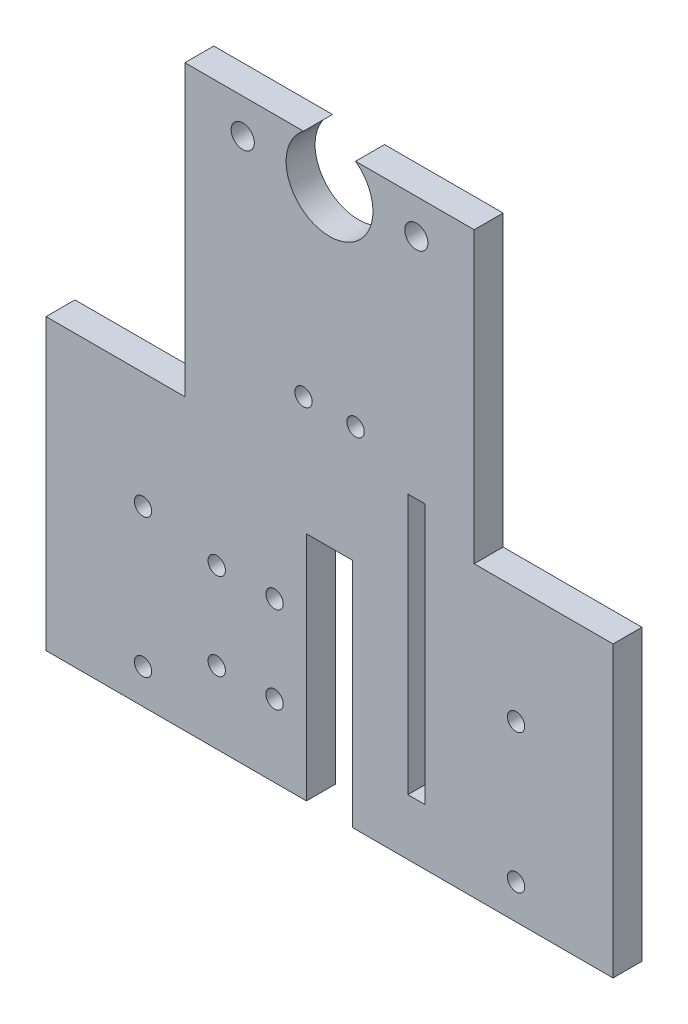
ISO-10303-21;
HEADER;
FILE_DESCRIPTION(('STEP AP214'),'2;1');
FILE_NAME('part.step','',(''),(''),'','','');
FILE_SCHEMA(('AUTOMOTIVE_DESIGN { 1 0 10303 214 1 1 1 1 }'));
ENDSEC;
DATA;
#1=APPLICATION_CONTEXT('core data for automotive mechanical design processes');
#2=APPLICATION_PROTOCOL_DEFINITION('international standard','automotive_design',2000,#1);
#3=PRODUCT_CONTEXT('',#1,'mechanical');
#4=PRODUCT('Part','Part','',(#3));
#5=PRODUCT_RELATED_PRODUCT_CATEGORY('part','',(#4));
#6=PRODUCT_DEFINITION_FORMATION('','',#4);
#7=PRODUCT_DEFINITION_CONTEXT('part definition',#1,'design');
#8=PRODUCT_DEFINITION('design','',#6,#7);
#9=PRODUCT_DEFINITION_SHAPE('','',#8);
#10=(LENGTH_UNIT() NAMED_UNIT(*) SI_UNIT(.MILLI.,.METRE.));
#11=(NAMED_UNIT(*) PLANE_ANGLE_UNIT() SI_UNIT($,.RADIAN.));
#12=(NAMED_UNIT(*) SI_UNIT($,.STERADIAN.) SOLID_ANGLE_UNIT());
#13=UNCERTAINTY_MEASURE_WITH_UNIT(LENGTH_MEASURE(1.E-05),#10,'distance_accuracy_value','');
#14=(GEOMETRIC_REPRESENTATION_CONTEXT(3) GLOBAL_UNCERTAINTY_ASSIGNED_CONTEXT((#13)) GLOBAL_UNIT_ASSIGNED_CONTEXT((#10,
#11,#12)) REPRESENTATION_CONTEXT('',''));
#15=CARTESIAN_POINT('',(0.,0.,0.));
#16=DIRECTION('',(0.,0.,1.));
#17=DIRECTION('',(1.,0.,0.));
#18=AXIS2_PLACEMENT_3D('',#15,#16,#17);
#19=CARTESIAN_POINT('',(32.235018022544,-44.,5.));
#20=DIRECTION('',(0.,0.,-1.));
#21=DIRECTION('',(-1.,0.,0.));
#22=AXIS2_PLACEMENT_3D('',#19,#20,#21);
#23=CYLINDRICAL_SURFACE('',#22,1.5);
#24=CARTESIAN_POINT('',(32.235018022544,-44.,5.));
#25=DIRECTION('',(0.,0.,-1.));
#26=DIRECTION('',(1.,0.,0.));
#27=AXIS2_PLACEMENT_3D('',#24,#25,#26);
#28=CIRCLE('',#27,1.5);
#29=CARTESIAN_POINT('',(33.735018022544,-44.,5.));
#30=VERTEX_POINT('',#29);
#31=EDGE_CURVE('E273',#30,#30,#28,.T.);
#32=ORIENTED_EDGE('',*,*,#31,.F.);
#33=EDGE_LOOP('',(#32));
#34=FACE_BOUND('',#33,.T.);
#35=CARTESIAN_POINT('',(32.235018022544,-44.,2.));
#36=DIRECTION('',(0.,0.,-1.));
#37=DIRECTION('',(-1.,0.,0.));
#38=AXIS2_PLACEMENT_3D('',#35,#36,#37);
#39=CIRCLE('',#38,1.5);
#40=CARTESIAN_POINT('',(30.735018022544,-44.,2.));
#41=VERTEX_POINT('',#40);
#42=EDGE_CURVE('E227',#41,#41,#39,.T.);
#43=ORIENTED_EDGE('',*,*,#42,.T.);
#44=EDGE_LOOP('',(#43));
#45=FACE_BOUND('',#44,.T.);
#46=ADVANCED_FACE('F39',(#34,#45),#23,.F.);
#47=CARTESIAN_POINT('',(-32.235018022544,-20.,5.));
#48=DIRECTION('',(0.,0.,-1.));
#49=DIRECTION('',(-1.,0.,0.));
#50=AXIS2_PLACEMENT_3D('',#47,#48,#49);
#51=CYLINDRICAL_SURFACE('',#50,1.5);
#52=CARTESIAN_POINT('',(-32.235018022544,-20.,5.));
#53=DIRECTION('',(0.,0.,-1.));
#54=DIRECTION('',(-1.,0.,0.));
#55=AXIS2_PLACEMENT_3D('',#52,#53,#54);
#56=CIRCLE('',#55,1.5);
#57=CARTESIAN_POINT('',(-33.735018022544,-20.,5.));
#58=VERTEX_POINT('',#57);
#59=EDGE_CURVE('E261',#58,#58,#56,.T.);
#60=ORIENTED_EDGE('',*,*,#59,.F.);
#61=EDGE_LOOP('',(#60));
#62=FACE_BOUND('',#61,.T.);
#63=CARTESIAN_POINT('',(-32.235018022544,-20.,2.));
#64=DIRECTION('',(0.,0.,-1.));
#65=DIRECTION('',(-1.,0.,0.));
#66=AXIS2_PLACEMENT_3D('',#63,#64,#65);
#67=CIRCLE('',#66,1.5);
#68=CARTESIAN_POINT('',(-33.735018022544,-20.,2.));
#69=VERTEX_POINT('',#68);
#70=EDGE_CURVE('E231',#69,#69,#67,.T.);
#71=ORIENTED_EDGE('',*,*,#70,.T.);
#72=EDGE_LOOP('',(#71));
#73=FACE_BOUND('',#72,.T.);
#74=ADVANCED_FACE('F510',(#62,#73),#51,.F.);
#75=CARTESIAN_POINT('',(-32.2350180225441,-44.,5.));
#76=DIRECTION('',(0.,0.,-1.));
#77=DIRECTION('',(-1.,0.,0.));
#78=AXIS2_PLACEMENT_3D('',#75,#76,#77);
#79=CYLINDRICAL_SURFACE('',#78,1.5);
#80=CARTESIAN_POINT('',(-32.2350180225441,-44.,5.));
#81=DIRECTION('',(0.,0.,-1.));
#82=DIRECTION('',(-1.,0.,0.));
#83=AXIS2_PLACEMENT_3D('',#80,#81,#82);
#84=CIRCLE('',#83,1.5);
#85=CARTESIAN_POINT('',(-33.7350180225441,-44.,5.));
#86=VERTEX_POINT('',#85);
#87=EDGE_CURVE('E268',#86,#86,#84,.T.);
#88=ORIENTED_EDGE('',*,*,#87,.F.);
#89=EDGE_LOOP('',(#88));
#90=FACE_BOUND('',#89,.T.);
#91=CARTESIAN_POINT('',(-32.2350180225441,-44.,2.));
#92=DIRECTION('',(0.,0.,-1.));
#93=DIRECTION('',(-1.,0.,0.));
#94=AXIS2_PLACEMENT_3D('',#91,#92,#93);
#95=CIRCLE('',#94,1.5);
#96=CARTESIAN_POINT('',(-33.7350180225441,-44.,2.));
#97=VERTEX_POINT('',#96);
#98=EDGE_CURVE('E211',#97,#97,#95,.T.);
#99=ORIENTED_EDGE('',*,*,#98,.T.);
#100=EDGE_LOOP('',(#99));
#101=FACE_BOUND('',#100,.T.);
#102=ADVANCED_FACE('F516',(#90,#101),#79,.F.);
#103=CARTESIAN_POINT('',(32.235018022544,-20.,5.));
#104=DIRECTION('',(0.,0.,-1.));
#105=DIRECTION('',(-1.,0.,0.));
#106=AXIS2_PLACEMENT_3D('',#103,#104,#105);
#107=CYLINDRICAL_SURFACE('',#106,1.5);
#108=CARTESIAN_POINT('',(32.235018022544,-20.,5.));
#109=DIRECTION('',(0.,0.,-1.));
#110=DIRECTION('',(1.,0.,0.));
#111=AXIS2_PLACEMENT_3D('',#108,#109,#110);
#112=CIRCLE('',#111,1.5);
#113=CARTESIAN_POINT('',(33.735018022544,-20.,5.));
#114=VERTEX_POINT('',#113);
#115=EDGE_CURVE('E269',#114,#114,#112,.T.);
#116=ORIENTED_EDGE('',*,*,#115,.F.);
#117=EDGE_LOOP('',(#116));
#118=FACE_BOUND('',#117,.T.);
#119=CARTESIAN_POINT('',(32.235018022544,-20.,2.));
#120=DIRECTION('',(0.,0.,-1.));
#121=DIRECTION('',(-1.,0.,0.));
#122=AXIS2_PLACEMENT_3D('',#119,#120,#121);
#123=CIRCLE('',#122,1.5);
#124=CARTESIAN_POINT('',(30.735018022544,-20.,2.));
#125=VERTEX_POINT('',#124);
#126=EDGE_CURVE('E217',#125,#125,#123,.T.);
#127=ORIENTED_EDGE('',*,*,#126,.T.);
#128=EDGE_LOOP('',(#127));
#129=FACE_BOUND('',#128,.T.);
#130=ADVANCED_FACE('F567',(#118,#129),#107,.F.);
#131=CARTESIAN_POINT('',(-25.,-50.,5.));
#132=DIRECTION('',(0.,1.,0.));
#133=DIRECTION('',(0.,0.,1.));
#134=AXIS2_PLACEMENT_3D('',#131,#132,#133);
#135=PLANE('',#134);
#136=DIRECTION('',(1.,0.,0.));
#137=VECTOR('',#136,1.);
#138=CARTESIAN_POINT('',(-25.,-50.,0.));
#139=LINE('',#138,#137);
#140=CARTESIAN_POINT('',(-49.,-50.,0.));
#141=VERTEX_POINT('',#140);
#142=CARTESIAN_POINT('',(-4.,-50.,0.));
#143=VERTEX_POINT('',#142);
#144=EDGE_CURVE('E395',#141,#143,#139,.T.);
#145=ORIENTED_EDGE('',*,*,#144,.T.);
#146=DIRECTION('',(0.,0.,-1.));
#147=VECTOR('',#146,1.);
#148=CARTESIAN_POINT('',(-4.,-50.,5.));
#149=LINE('',#148,#147);
#150=CARTESIAN_POINT('',(-4.,-50.,5.));
#151=VERTEX_POINT('',#150);
#152=EDGE_CURVE('E308',#151,#143,#149,.T.);
#153=ORIENTED_EDGE('',*,*,#152,.F.);
#154=DIRECTION('',(1.,0.,0.));
#155=VECTOR('',#154,1.);
#156=CARTESIAN_POINT('',(25.,-50.,5.));
#157=LINE('',#156,#155);
#158=CARTESIAN_POINT('',(-49.,-50.,5.));
#159=VERTEX_POINT('',#158);
#160=EDGE_CURVE('E340',#159,#151,#157,.T.);
#161=ORIENTED_EDGE('',*,*,#160,.F.);
#162=DIRECTION('',(0.,0.,-1.));
#163=VECTOR('',#162,1.);
#164=CARTESIAN_POINT('',(-49.,-50.,5.));
#165=LINE('',#164,#163);
#166=EDGE_CURVE('E369',#159,#141,#165,.T.);
#167=ORIENTED_EDGE('',*,*,#166,.T.);
#168=EDGE_LOOP('',(#145,#153,#161,#167));
#169=FACE_BOUND('',#168,.T.);
#170=ADVANCED_FACE('F465',(#169),#135,.F.);
#171=CARTESIAN_POINT('',(-25.,50.,5.));
#172=DIRECTION('',(0.,-1.,0.));
#173=DIRECTION('',(0.,0.,-1.));
#174=AXIS2_PLACEMENT_3D('',#171,#172,#173);
#175=PLANE('',#174);
#176=DIRECTION('',(-1.,0.,0.));
#177=VECTOR('',#176,1.);
#178=CARTESIAN_POINT('',(-25.,50.,0.));
#179=LINE('',#178,#177);
#180=CARTESIAN_POINT('',(25.,50.,0.));
#181=VERTEX_POINT('',#180);
#182=CARTESIAN_POINT('',(4.50000000000001,50.,0.));
#183=VERTEX_POINT('',#182);
#184=EDGE_CURVE('E380',#181,#183,#179,.T.);
#185=ORIENTED_EDGE('',*,*,#184,.T.);
#186=DIRECTION('',(0.,0.,1.));
#187=VECTOR('',#186,1.);
#188=CARTESIAN_POINT('',(4.50000000000001,50.,-5.));
#189=LINE('',#188,#187);
#190=CARTESIAN_POINT('',(4.50000000000001,50.,5.));
#191=VERTEX_POINT('',#190);
#192=EDGE_CURVE('E11',#183,#191,#189,.T.);
#193=ORIENTED_EDGE('',*,*,#192,.T.);
#194=DIRECTION('',(-1.,0.,0.));
#195=VECTOR('',#194,1.);
#196=CARTESIAN_POINT('',(-25.,50.,5.));
#197=LINE('',#196,#195);
#198=CARTESIAN_POINT('',(25.,50.,5.));
#199=VERTEX_POINT('',#198);
#200=EDGE_CURVE('E355',#199,#191,#197,.T.);
#201=ORIENTED_EDGE('',*,*,#200,.F.);
#202=DIRECTION('',(0.,0.,-1.));
#203=VECTOR('',#202,1.);
#204=CARTESIAN_POINT('',(25.,50.,5.));
#205=LINE('',#204,#203);
#206=EDGE_CURVE('E414',#199,#181,#205,.T.);
#207=ORIENTED_EDGE('',*,*,#206,.T.);
#208=EDGE_LOOP('',(#185,#193,#201,#207));
#209=FACE_BOUND('',#208,.T.);
#210=ADVANCED_FACE('F496',(#209),#175,.F.);
#211=CARTESIAN_POINT('',(0.,0.,5.));
#212=DIRECTION('',(0.,0.,1.));
#213=DIRECTION('',(1.,0.,0.));
#214=AXIS2_PLACEMENT_3D('',#211,#212,#213);
#215=PLANE('',#214);
#216=CARTESIAN_POINT('',(-9.5,-37.5,5.));
#217=DIRECTION('',(0.,0.,1.));
#218=DIRECTION('',(1.,0.,0.));
#219=AXIS2_PLACEMENT_3D('',#216,#217,#218);
#220=CIRCLE('',#219,1.5);
#221=CARTESIAN_POINT('',(-8.,-37.5,5.));
#222=VERTEX_POINT('',#221);
#223=EDGE_CURVE('E891',#222,#222,#220,.T.);
#224=ORIENTED_EDGE('',*,*,#223,.F.);
#225=EDGE_LOOP('',(#224));
#226=FACE_BOUND('',#225,.T.);
#227=CARTESIAN_POINT('',(-19.5,-37.5,5.));
#228=DIRECTION('',(0.,0.,1.));
#229=DIRECTION('',(1.,0.,0.));
#230=AXIS2_PLACEMENT_3D('',#227,#228,#229);
#231=CIRCLE('',#230,1.5);
#232=CARTESIAN_POINT('',(-18.,-37.5,5.));
#233=VERTEX_POINT('',#232);
#234=EDGE_CURVE('E897',#233,#233,#231,.T.);
#235=ORIENTED_EDGE('',*,*,#234,.F.);
#236=EDGE_LOOP('',(#235));
#237=FACE_BOUND('',#236,.T.);
#238=CARTESIAN_POINT('',(-19.5,-22.5,5.));
#239=DIRECTION('',(0.,0.,1.));
#240=DIRECTION('',(1.,0.,0.));
#241=AXIS2_PLACEMENT_3D('',#238,#239,#240);
#242=CIRCLE('',#241,1.5);
#243=CARTESIAN_POINT('',(-18.,-22.5,5.));
#244=VERTEX_POINT('',#243);
#245=EDGE_CURVE('E912',#244,#244,#242,.T.);
#246=ORIENTED_EDGE('',*,*,#245,.F.);
#247=EDGE_LOOP('',(#246));
#248=FACE_BOUND('',#247,.T.);
#249=CARTESIAN_POINT('',(-9.5,-22.5,5.));
#250=DIRECTION('',(0.,0.,1.));
#251=DIRECTION('',(1.,0.,0.));
#252=AXIS2_PLACEMENT_3D('',#249,#250,#251);
#253=CIRCLE('',#252,1.5);
#254=CARTESIAN_POINT('',(-8.,-22.5,5.));
#255=VERTEX_POINT('',#254);
#256=EDGE_CURVE('E916',#255,#255,#253,.T.);
#257=ORIENTED_EDGE('',*,*,#256,.F.);
#258=EDGE_LOOP('',(#257));
#259=FACE_BOUND('',#258,.T.);
#260=CARTESIAN_POINT('',(4.5,10.25,5.));
#261=DIRECTION('',(0.,0.,1.));
#262=DIRECTION('',(1.,0.,0.));
#263=AXIS2_PLACEMENT_3D('',#260,#261,#262);
#264=CIRCLE('',#263,1.5);
#265=CARTESIAN_POINT('',(5.99999999999999,10.25,5.));
#266=VERTEX_POINT('',#265);
#267=EDGE_CURVE('E193',#266,#266,#264,.T.);
#268=ORIENTED_EDGE('',*,*,#267,.F.);
#269=EDGE_LOOP('',(#268));
#270=FACE_BOUND('',#269,.T.);
#271=CARTESIAN_POINT('',(-4.49999999999998,10.25,5.));
#272=DIRECTION('',(0.,0.,1.));
#273=DIRECTION('',(1.,0.,0.));
#274=AXIS2_PLACEMENT_3D('',#271,#272,#273);
#275=CIRCLE('',#274,1.5);
#276=CARTESIAN_POINT('',(-2.99999999999999,10.25,5.));
#277=VERTEX_POINT('',#276);
#278=EDGE_CURVE('E884',#277,#277,#275,.T.);
#279=ORIENTED_EDGE('',*,*,#278,.F.);
#280=EDGE_LOOP('',(#279));
#281=FACE_BOUND('',#280,.T.);
#282=DIRECTION('',(0.,1.,0.));
#283=VECTOR('',#282,1.);
#284=CARTESIAN_POINT('',(13.5359264064246,4.71025987059766,5.));
#285=LINE('',#284,#283);
#286=CARTESIAN_POINT('',(13.5359264064246,-40.2897401294023,5.));
#287=VERTEX_POINT('',#286);
#288=CARTESIAN_POINT('',(13.5359264064246,4.71025987059766,5.));
#289=VERTEX_POINT('',#288);
#290=EDGE_CURVE('E167',#287,#289,#285,.T.);
#291=ORIENTED_EDGE('',*,*,#290,.T.);
#292=DIRECTION('',(1.,0.,0.));
#293=VECTOR('',#292,1.);
#294=CARTESIAN_POINT('',(13.5359264064246,4.71025987059766,5.));
#295=LINE('',#294,#293);
#296=CARTESIAN_POINT('',(16.5359264064246,4.71025987059766,5.));
#297=VERTEX_POINT('',#296);
#298=EDGE_CURVE('E177',#289,#297,#295,.T.);
#299=ORIENTED_EDGE('',*,*,#298,.T.);
#300=DIRECTION('',(0.,-1.,0.));
#301=VECTOR('',#300,1.);
#302=CARTESIAN_POINT('',(16.5359264064246,4.71025987059766,5.));
#303=LINE('',#302,#301);
#304=CARTESIAN_POINT('',(16.5359264064246,-40.2897401294023,5.));
#305=VERTEX_POINT('',#304);
#306=EDGE_CURVE('E55',#297,#305,#303,.T.);
#307=ORIENTED_EDGE('',*,*,#306,.T.);
#308=DIRECTION('',(-1.,0.,0.));
#309=VECTOR('',#308,1.);
#310=CARTESIAN_POINT('',(13.5359264064246,-40.2897401294023,5.));
#311=LINE('',#310,#309);
#312=EDGE_CURVE('E174',#305,#287,#311,.T.);
#313=ORIENTED_EDGE('',*,*,#312,.T.);
#314=EDGE_LOOP('',(#291,#299,#307,#313));
#315=FACE_BOUND('',#314,.T.);
#316=ORIENTED_EDGE('',*,*,#115,.T.);
#317=EDGE_LOOP('',(#316));
#318=FACE_BOUND('',#317,.T.);
#319=ORIENTED_EDGE('',*,*,#87,.T.);
#320=EDGE_LOOP('',(#319));
#321=FACE_BOUND('',#320,.T.);
#322=ORIENTED_EDGE('',*,*,#59,.T.);
#323=EDGE_LOOP('',(#322));
#324=FACE_BOUND('',#323,.T.);
#325=ORIENTED_EDGE('',*,*,#31,.T.);
#326=EDGE_LOOP('',(#325));
#327=FACE_BOUND('',#326,.T.);
#328=DIRECTION('',(0.,1.,0.));
#329=VECTOR('',#328,1.);
#330=CARTESIAN_POINT('',(-4.,-50.,5.));
#331=LINE('',#330,#329);
#332=CARTESIAN_POINT('',(-4.,-9.99999999999999,5.));
#333=VERTEX_POINT('',#332);
#334=EDGE_CURVE('E290',#151,#333,#331,.T.);
#335=ORIENTED_EDGE('',*,*,#334,.T.);
#336=DIRECTION('',(1.,0.,0.));
#337=VECTOR('',#336,1.);
#338=CARTESIAN_POINT('',(-4.,-9.99999999999999,5.));
#339=LINE('',#338,#337);
#340=CARTESIAN_POINT('',(4.,-10.,5.));
#341=VERTEX_POINT('',#340);
#342=EDGE_CURVE('E281',#333,#341,#339,.T.);
#343=ORIENTED_EDGE('',*,*,#342,.T.);
#344=DIRECTION('',(0.,-1.,0.));
#345=VECTOR('',#344,1.);
#346=CARTESIAN_POINT('',(4.,-10.,5.));
#347=LINE('',#346,#345);
#348=CARTESIAN_POINT('',(4.,-50.0000000000002,5.));
#349=VERTEX_POINT('',#348);
#350=EDGE_CURVE('E285',#341,#349,#347,.T.);
#351=ORIENTED_EDGE('',*,*,#350,.T.);
#352=CARTESIAN_POINT('',(49.,-50.,5.));
#353=VERTEX_POINT('',#352);
#354=EDGE_CURVE('E345',#349,#353,#157,.T.);
#355=ORIENTED_EDGE('',*,*,#354,.T.);
#356=DIRECTION('',(0.,1.,0.));
#357=VECTOR('',#356,1.);
#358=CARTESIAN_POINT('',(49.,-50.,5.));
#359=LINE('',#358,#357);
#360=CARTESIAN_POINT('',(49.,0.,5.));
#361=VERTEX_POINT('',#360);
#362=EDGE_CURVE('E344',#353,#361,#359,.T.);
#363=ORIENTED_EDGE('',*,*,#362,.T.);
#364=DIRECTION('',(-1.,0.,0.));
#365=VECTOR('',#364,1.);
#366=CARTESIAN_POINT('',(49.,0.,5.));
#367=LINE('',#366,#365);
#368=CARTESIAN_POINT('',(25.,0.,5.));
#369=VERTEX_POINT('',#368);
#370=EDGE_CURVE('E348',#361,#369,#367,.T.);
#371=ORIENTED_EDGE('',*,*,#370,.T.);
#372=DIRECTION('',(0.,1.,0.));
#373=VECTOR('',#372,1.);
#374=CARTESIAN_POINT('',(25.,32.4243225836377,5.));
#375=LINE('',#374,#373);
#376=EDGE_CURVE('E351',#369,#199,#375,.T.);
#377=ORIENTED_EDGE('',*,*,#376,.T.);
#378=ORIENTED_EDGE('',*,*,#200,.T.);
#379=CARTESIAN_POINT('',(0.,44.,5.));
#380=DIRECTION('',(0.,0.,1.));
#381=DIRECTION('',(1.,0.,0.));
#382=AXIS2_PLACEMENT_3D('',#379,#380,#381);
#383=CIRCLE('',#382,7.5);
#384=CARTESIAN_POINT('',(-4.5,50.,5.));
#385=VERTEX_POINT('',#384);
#386=EDGE_CURVE('E307',#385,#191,#383,.T.);
#387=ORIENTED_EDGE('',*,*,#386,.F.);
#388=CARTESIAN_POINT('',(-25.,50.,5.));
#389=VERTEX_POINT('',#388);
#390=EDGE_CURVE('E354',#385,#389,#197,.T.);
#391=ORIENTED_EDGE('',*,*,#390,.T.);
#392=DIRECTION('',(0.,-1.,0.));
#393=VECTOR('',#392,1.);
#394=CARTESIAN_POINT('',(-25.,50.,5.));
#395=LINE('',#394,#393);
#396=CARTESIAN_POINT('',(-25.,0.,5.));
#397=VERTEX_POINT('',#396);
#398=EDGE_CURVE('E359',#389,#397,#395,.T.);
#399=ORIENTED_EDGE('',*,*,#398,.T.);
#400=DIRECTION('',(-1.,0.,0.));
#401=VECTOR('',#400,1.);
#402=CARTESIAN_POINT('',(-49.,0.,5.));
#403=LINE('',#402,#401);
#404=CARTESIAN_POINT('',(-49.,0.,5.));
#405=VERTEX_POINT('',#404);
#406=EDGE_CURVE('E362',#397,#405,#403,.T.);
#407=ORIENTED_EDGE('',*,*,#406,.T.);
#408=DIRECTION('',(0.,-1.,0.));
#409=VECTOR('',#408,1.);
#410=CARTESIAN_POINT('',(-49.,-50.,5.));
#411=LINE('',#410,#409);
#412=EDGE_CURVE('E365',#405,#159,#411,.T.);
#413=ORIENTED_EDGE('',*,*,#412,.T.);
#414=ORIENTED_EDGE('',*,*,#160,.T.);
#415=EDGE_LOOP('',(#335,#343,#351,#355,#363,#371,#377,#378,#387,#391,#399,#407,#413,#414));
#416=FACE_BOUND('',#415,.T.);
#417=CARTESIAN_POINT('',(-15.,44.,5.));
#418=DIRECTION('',(0.,0.,1.));
#419=DIRECTION('',(1.,0.,0.));
#420=AXIS2_PLACEMENT_3D('',#417,#418,#419);
#421=CIRCLE('',#420,2.);
#422=CARTESIAN_POINT('',(-13.,44.,5.));
#423=VERTEX_POINT('',#422);
#424=EDGE_CURVE('E332',#423,#423,#421,.T.);
#425=ORIENTED_EDGE('',*,*,#424,.F.);
#426=EDGE_LOOP('',(#425));
#427=FACE_BOUND('',#426,.T.);
#428=CARTESIAN_POINT('',(15.,44.,5.));
#429=DIRECTION('',(0.,0.,1.));
#430=DIRECTION('',(-1.,0.,0.));
#431=AXIS2_PLACEMENT_3D('',#428,#429,#430);
#432=CIRCLE('',#431,2.);
#433=CARTESIAN_POINT('',(13.,44.,5.));
#434=VERTEX_POINT('',#433);
#435=EDGE_CURVE('E324',#434,#434,#432,.T.);
#436=ORIENTED_EDGE('',*,*,#435,.F.);
#437=EDGE_LOOP('',(#436));
#438=FACE_BOUND('',#437,.T.);
#439=ADVANCED_FACE('F182',(#226,#237,#248,#259,#270,#281,#315,#318,#321,#324,#327,#416,#427,
#438),#215,.T.);
#440=CARTESIAN_POINT('',(0.,0.,0.));
#441=DIRECTION('',(0.,0.,1.));
#442=DIRECTION('',(1.,0.,0.));
#443=AXIS2_PLACEMENT_3D('',#440,#441,#442);
#444=PLANE('',#443);
#445=CARTESIAN_POINT('',(-9.5,-37.5,0.));
#446=DIRECTION('',(0.,0.,-1.));
#447=DIRECTION('',(-1.,0.,0.));
#448=AXIS2_PLACEMENT_3D('',#445,#446,#447);
#449=CIRCLE('',#448,1.5);
#450=CARTESIAN_POINT('',(-11.,-37.5,0.));
#451=VERTEX_POINT('',#450);
#452=EDGE_CURVE('E925',#451,#451,#449,.T.);
#453=ORIENTED_EDGE('',*,*,#452,.F.);
#454=EDGE_LOOP('',(#453));
#455=FACE_BOUND('',#454,.T.);
#456=CARTESIAN_POINT('',(-19.5,-37.5,0.));
#457=DIRECTION('',(0.,0.,-1.));
#458=DIRECTION('',(-1.,0.,0.));
#459=AXIS2_PLACEMENT_3D('',#456,#457,#458);
#460=CIRCLE('',#459,1.5);
#461=CARTESIAN_POINT('',(-21.,-37.5,0.));
#462=VERTEX_POINT('',#461);
#463=EDGE_CURVE('E929',#462,#462,#460,.T.);
#464=ORIENTED_EDGE('',*,*,#463,.F.);
#465=EDGE_LOOP('',(#464));
#466=FACE_BOUND('',#465,.T.);
#467=CARTESIAN_POINT('',(-19.5,-22.5,0.));
#468=DIRECTION('',(0.,0.,-1.));
#469=DIRECTION('',(-1.,0.,0.));
#470=AXIS2_PLACEMENT_3D('',#467,#468,#469);
#471=CIRCLE('',#470,1.5);
#472=CARTESIAN_POINT('',(-21.,-22.5,0.));
#473=VERTEX_POINT('',#472);
#474=EDGE_CURVE('E924',#473,#473,#471,.T.);
#475=ORIENTED_EDGE('',*,*,#474,.F.);
#476=EDGE_LOOP('',(#475));
#477=FACE_BOUND('',#476,.T.);
#478=CARTESIAN_POINT('',(-9.5,-22.5,0.));
#479=DIRECTION('',(0.,0.,-1.));
#480=DIRECTION('',(-1.,0.,0.));
#481=AXIS2_PLACEMENT_3D('',#478,#479,#480);
#482=CIRCLE('',#481,1.5);
#483=CARTESIAN_POINT('',(-11.,-22.5,0.));
#484=VERTEX_POINT('',#483);
#485=EDGE_CURVE('E920',#484,#484,#482,.T.);
#486=ORIENTED_EDGE('',*,*,#485,.F.);
#487=EDGE_LOOP('',(#486));
#488=FACE_BOUND('',#487,.T.);
#489=CARTESIAN_POINT('',(4.5,10.25,0.));
#490=DIRECTION('',(0.,0.,-1.));
#491=DIRECTION('',(-1.,0.,0.));
#492=AXIS2_PLACEMENT_3D('',#489,#490,#491);
#493=CIRCLE('',#492,1.5);
#494=CARTESIAN_POINT('',(3.,10.25,0.));
#495=VERTEX_POINT('',#494);
#496=EDGE_CURVE('E890',#495,#495,#493,.T.);
#497=ORIENTED_EDGE('',*,*,#496,.F.);
#498=EDGE_LOOP('',(#497));
#499=FACE_BOUND('',#498,.T.);
#500=CARTESIAN_POINT('',(-4.49999999999998,10.25,0.));
#501=DIRECTION('',(0.,0.,-1.));
#502=DIRECTION('',(1.,0.,0.));
#503=AXIS2_PLACEMENT_3D('',#500,#501,#502);
#504=CIRCLE('',#503,1.5);
#505=CARTESIAN_POINT('',(-2.99999999999999,10.25,0.));
#506=VERTEX_POINT('',#505);
#507=EDGE_CURVE('E887',#506,#506,#504,.T.);
#508=ORIENTED_EDGE('',*,*,#507,.F.);
#509=EDGE_LOOP('',(#508));
#510=FACE_BOUND('',#509,.T.);
#511=DIRECTION('',(1.,0.,0.));
#512=VECTOR('',#511,1.);
#513=CARTESIAN_POINT('',(13.5359264064246,4.71025987059766,0.));
#514=LINE('',#513,#512);
#515=CARTESIAN_POINT('',(13.5359264064246,4.71025987059766,0.));
#516=VERTEX_POINT('',#515);
#517=CARTESIAN_POINT('',(16.5359264064246,4.71025987059766,0.));
#518=VERTEX_POINT('',#517);
#519=EDGE_CURVE('E202',#516,#518,#514,.T.);
#520=ORIENTED_EDGE('',*,*,#519,.F.);
#521=DIRECTION('',(0.,1.,0.));
#522=VECTOR('',#521,1.);
#523=CARTESIAN_POINT('',(13.5359264064246,4.71025987059766,0.));
#524=LINE('',#523,#522);
#525=CARTESIAN_POINT('',(13.5359264064246,-40.2897401294023,0.));
#526=VERTEX_POINT('',#525);
#527=EDGE_CURVE('E63',#526,#516,#524,.T.);
#528=ORIENTED_EDGE('',*,*,#527,.F.);
#529=DIRECTION('',(-1.,0.,0.));
#530=VECTOR('',#529,1.);
#531=CARTESIAN_POINT('',(13.5359264064246,-40.2897401294023,0.));
#532=LINE('',#531,#530);
#533=CARTESIAN_POINT('',(16.5359264064246,-40.2897401294023,0.));
#534=VERTEX_POINT('',#533);
#535=EDGE_CURVE('E186',#534,#526,#532,.T.);
#536=ORIENTED_EDGE('',*,*,#535,.F.);
#537=DIRECTION('',(0.,-1.,0.));
#538=VECTOR('',#537,1.);
#539=CARTESIAN_POINT('',(16.5359264064246,4.71025987059766,0.));
#540=LINE('',#539,#538);
#541=EDGE_CURVE('E190',#518,#534,#540,.T.);
#542=ORIENTED_EDGE('',*,*,#541,.F.);
#543=EDGE_LOOP('',(#520,#528,#536,#542));
#544=FACE_BOUND('',#543,.T.);
#545=CARTESIAN_POINT('',(-32.2350180225441,-44.,0.));
#546=DIRECTION('',(0.,0.,-1.));
#547=DIRECTION('',(-1.,0.,0.));
#548=AXIS2_PLACEMENT_3D('',#545,#546,#547);
#549=CIRCLE('',#548,4.50000000000001);
#550=CARTESIAN_POINT('',(-36.7350180225441,-44.,0.));
#551=VERTEX_POINT('',#550);
#552=EDGE_CURVE('E246',#551,#551,#549,.T.);
#553=ORIENTED_EDGE('',*,*,#552,.F.);
#554=EDGE_LOOP('',(#553));
#555=FACE_BOUND('',#554,.T.);
#556=CARTESIAN_POINT('',(-32.235018022544,-20.,0.));
#557=DIRECTION('',(0.,0.,-1.));
#558=DIRECTION('',(-1.,0.,0.));
#559=AXIS2_PLACEMENT_3D('',#556,#557,#558);
#560=CIRCLE('',#559,4.5);
#561=CARTESIAN_POINT('',(-36.7350180225441,-20.,0.));
#562=VERTEX_POINT('',#561);
#563=EDGE_CURVE('E235',#562,#562,#560,.T.);
#564=ORIENTED_EDGE('',*,*,#563,.F.);
#565=EDGE_LOOP('',(#564));
#566=FACE_BOUND('',#565,.T.);
#567=CARTESIAN_POINT('',(32.235018022544,-20.,0.));
#568=DIRECTION('',(0.,0.,-1.));
#569=DIRECTION('',(-1.,0.,0.));
#570=AXIS2_PLACEMENT_3D('',#567,#568,#569);
#571=CIRCLE('',#570,4.5);
#572=CARTESIAN_POINT('',(27.735018022544,-20.,0.));
#573=VERTEX_POINT('',#572);
#574=EDGE_CURVE('E221',#573,#573,#571,.T.);
#575=ORIENTED_EDGE('',*,*,#574,.F.);
#576=EDGE_LOOP('',(#575));
#577=FACE_BOUND('',#576,.T.);
#578=CARTESIAN_POINT('',(32.235018022544,-44.,0.));
#579=DIRECTION('',(0.,0.,-1.));
#580=DIRECTION('',(-1.,0.,0.));
#581=AXIS2_PLACEMENT_3D('',#578,#579,#580);
#582=CIRCLE('',#581,4.5);
#583=CARTESIAN_POINT('',(27.735018022544,-44.,0.));
#584=VERTEX_POINT('',#583);
#585=EDGE_CURVE('E256',#584,#584,#582,.T.);
#586=ORIENTED_EDGE('',*,*,#585,.F.);
#587=EDGE_LOOP('',(#586));
#588=FACE_BOUND('',#587,.T.);
#589=DIRECTION('',(1.,0.,0.));
#590=VECTOR('',#589,1.);
#591=CARTESIAN_POINT('',(-4.,-9.99999999999999,0.));
#592=LINE('',#591,#590);
#593=CARTESIAN_POINT('',(-4.,-9.99999999999999,0.));
#594=VERTEX_POINT('',#593);
#595=CARTESIAN_POINT('',(4.,-10.,0.));
#596=VERTEX_POINT('',#595);
#597=EDGE_CURVE('E280',#594,#596,#592,.T.);
#598=ORIENTED_EDGE('',*,*,#597,.F.);
#599=DIRECTION('',(0.,1.,0.));
#600=VECTOR('',#599,1.);
#601=CARTESIAN_POINT('',(-4.,-50.,0.));
#602=LINE('',#601,#600);
#603=EDGE_CURVE('E286',#143,#594,#602,.T.);
#604=ORIENTED_EDGE('',*,*,#603,.F.);
#605=ORIENTED_EDGE('',*,*,#144,.F.);
#606=DIRECTION('',(0.,-1.,0.));
#607=VECTOR('',#606,1.);
#608=CARTESIAN_POINT('',(-49.,-50.,0.));
#609=LINE('',#608,#607);
#610=CARTESIAN_POINT('',(-49.,0.,0.));
#611=VERTEX_POINT('',#610);
#612=EDGE_CURVE('E390',#611,#141,#609,.T.);
#613=ORIENTED_EDGE('',*,*,#612,.F.);
#614=DIRECTION('',(-1.,0.,0.));
#615=VECTOR('',#614,1.);
#616=CARTESIAN_POINT('',(-49.,0.,0.));
#617=LINE('',#616,#615);
#618=CARTESIAN_POINT('',(-25.,0.,0.));
#619=VERTEX_POINT('',#618);
#620=EDGE_CURVE('E387',#619,#611,#617,.T.);
#621=ORIENTED_EDGE('',*,*,#620,.F.);
#622=DIRECTION('',(0.,-1.,0.));
#623=VECTOR('',#622,1.);
#624=CARTESIAN_POINT('',(-25.,32.4243225836377,0.));
#625=LINE('',#624,#623);
#626=CARTESIAN_POINT('',(-25.,50.,0.));
#627=VERTEX_POINT('',#626);
#628=EDGE_CURVE('E384',#627,#619,#625,.T.);
#629=ORIENTED_EDGE('',*,*,#628,.F.);
#630=CARTESIAN_POINT('',(-4.5,50.,0.));
#631=VERTEX_POINT('',#630);
#632=EDGE_CURVE('E379',#631,#627,#179,.T.);
#633=ORIENTED_EDGE('',*,*,#632,.F.);
#634=CARTESIAN_POINT('',(0.,44.,0.));
#635=DIRECTION('',(0.,0.,1.));
#636=DIRECTION('',(1.,0.,0.));
#637=AXIS2_PLACEMENT_3D('',#634,#635,#636);
#638=CIRCLE('',#637,7.5);
#639=EDGE_CURVE('E319',#631,#183,#638,.T.);
#640=ORIENTED_EDGE('',*,*,#639,.T.);
#641=ORIENTED_EDGE('',*,*,#184,.F.);
#642=DIRECTION('',(0.,1.,0.));
#643=VECTOR('',#642,1.);
#644=CARTESIAN_POINT('',(25.,50.,0.));
#645=LINE('',#644,#643);
#646=CARTESIAN_POINT('',(25.,0.,0.));
#647=VERTEX_POINT('',#646);
#648=EDGE_CURVE('E376',#647,#181,#645,.T.);
#649=ORIENTED_EDGE('',*,*,#648,.F.);
#650=DIRECTION('',(-1.,0.,0.));
#651=VECTOR('',#650,1.);
#652=CARTESIAN_POINT('',(49.,0.,0.));
#653=LINE('',#652,#651);
#654=CARTESIAN_POINT('',(49.,0.,0.));
#655=VERTEX_POINT('',#654);
#656=EDGE_CURVE('E372',#655,#647,#653,.T.);
#657=ORIENTED_EDGE('',*,*,#656,.F.);
#658=DIRECTION('',(0.,1.,0.));
#659=VECTOR('',#658,1.);
#660=CARTESIAN_POINT('',(49.,-50.,0.));
#661=LINE('',#660,#659);
#662=CARTESIAN_POINT('',(49.,-50.,0.));
#663=VERTEX_POINT('',#662);
#664=EDGE_CURVE('E336',#663,#655,#661,.T.);
#665=ORIENTED_EDGE('',*,*,#664,.F.);
#666=CARTESIAN_POINT('',(4.,-50.,0.));
#667=VERTEX_POINT('',#666);
#668=EDGE_CURVE('E394',#667,#663,#139,.T.);
#669=ORIENTED_EDGE('',*,*,#668,.F.);
#670=DIRECTION('',(0.,-1.,0.));
#671=VECTOR('',#670,1.);
#672=CARTESIAN_POINT('',(4.,-10.,0.));
#673=LINE('',#672,#671);
#674=EDGE_CURVE('E298',#596,#667,#673,.T.);
#675=ORIENTED_EDGE('',*,*,#674,.F.);
#676=EDGE_LOOP('',(#598,#604,#605,#613,#621,#629,#633,#640,#641,#649,#657,#665,#669,#675));
#677=FACE_BOUND('',#676,.T.);
#678=CARTESIAN_POINT('',(-15.,44.,0.));
#679=DIRECTION('',(0.,0.,1.));
#680=DIRECTION('',(1.,0.,0.));
#681=AXIS2_PLACEMENT_3D('',#678,#679,#680);
#682=CIRCLE('',#681,2.);
#683=CARTESIAN_POINT('',(-13.,44.,0.));
#684=VERTEX_POINT('',#683);
#685=EDGE_CURVE('E328',#684,#684,#682,.T.);
#686=ORIENTED_EDGE('',*,*,#685,.T.);
#687=EDGE_LOOP('',(#686));
#688=FACE_BOUND('',#687,.T.);
#689=CARTESIAN_POINT('',(15.,44.,0.));
#690=DIRECTION('',(0.,0.,1.));
#691=DIRECTION('',(-1.,0.,0.));
#692=AXIS2_PLACEMENT_3D('',#689,#690,#691);
#693=CIRCLE('',#692,2.);
#694=CARTESIAN_POINT('',(13.,44.,0.));
#695=VERTEX_POINT('',#694);
#696=EDGE_CURVE('E323',#695,#695,#693,.T.);
#697=ORIENTED_EDGE('',*,*,#696,.T.);
#698=EDGE_LOOP('',(#697));
#699=FACE_BOUND('',#698,.T.);
#700=ADVANCED_FACE('F441',(#455,#466,#477,#488,#499,#510,#544,#555,#566,#577,#588,#677,#688,
#699),#444,.F.);
#701=CARTESIAN_POINT('',(49.,-50.,5.));
#702=DIRECTION('',(-1.,0.,0.));
#703=DIRECTION('',(0.,-1.,0.));
#704=AXIS2_PLACEMENT_3D('',#701,#702,#703);
#705=PLANE('',#704);
#706=ORIENTED_EDGE('',*,*,#664,.T.);
#707=DIRECTION('',(0.,0.,-1.));
#708=VECTOR('',#707,1.);
#709=CARTESIAN_POINT('',(49.,0.,5.));
#710=LINE('',#709,#708);
#711=EDGE_CURVE('E422',#361,#655,#710,.T.);
#712=ORIENTED_EDGE('',*,*,#711,.F.);
#713=ORIENTED_EDGE('',*,*,#362,.F.);
#714=DIRECTION('',(0.,0.,-1.));
#715=VECTOR('',#714,1.);
#716=CARTESIAN_POINT('',(49.,-50.,5.));
#717=LINE('',#716,#715);
#718=EDGE_CURVE('E426',#353,#663,#717,.T.);
#719=ORIENTED_EDGE('',*,*,#718,.T.);
#720=EDGE_LOOP('',(#706,#712,#713,#719));
#721=FACE_BOUND('',#720,.T.);
#722=ADVANCED_FACE('F41',(#721),#705,.F.);
#723=CARTESIAN_POINT('',(49.,0.,5.));
#724=DIRECTION('',(0.,-1.,0.));
#725=DIRECTION('',(1.,0.,0.));
#726=AXIS2_PLACEMENT_3D('',#723,#724,#725);
#727=PLANE('',#726);
#728=ORIENTED_EDGE('',*,*,#656,.T.);
#729=DIRECTION('',(0.,0.,-1.));
#730=VECTOR('',#729,1.);
#731=CARTESIAN_POINT('',(25.,0.,5.));
#732=LINE('',#731,#730);
#733=EDGE_CURVE('E418',#369,#647,#732,.T.);
#734=ORIENTED_EDGE('',*,*,#733,.F.);
#735=ORIENTED_EDGE('',*,*,#370,.F.);
#736=ORIENTED_EDGE('',*,*,#711,.T.);
#737=EDGE_LOOP('',(#728,#734,#735,#736));
#738=FACE_BOUND('',#737,.T.);
#739=ADVANCED_FACE('F490',(#738),#727,.F.);
#740=CARTESIAN_POINT('',(25.,50.,5.));
#741=DIRECTION('',(-1.,0.,0.));
#742=DIRECTION('',(0.,-1.,0.));
#743=AXIS2_PLACEMENT_3D('',#740,#741,#742);
#744=PLANE('',#743);
#745=ORIENTED_EDGE('',*,*,#648,.T.);
#746=ORIENTED_EDGE('',*,*,#206,.F.);
#747=ORIENTED_EDGE('',*,*,#376,.F.);
#748=ORIENTED_EDGE('',*,*,#733,.T.);
#749=EDGE_LOOP('',(#745,#746,#747,#748));
#750=FACE_BOUND('',#749,.T.);
#751=ADVANCED_FACE('F493',(#750),#744,.F.);
#752=ORIENTED_EDGE('',*,*,#390,.F.);
#753=DIRECTION('',(0.,0.,1.));
#754=VECTOR('',#753,1.);
#755=CARTESIAN_POINT('',(-4.5,50.,-5.));
#756=LINE('',#755,#754);
#757=EDGE_CURVE('E48',#385,#631,#756,.F.);
#758=ORIENTED_EDGE('',*,*,#757,.T.);
#759=ORIENTED_EDGE('',*,*,#632,.T.);
#760=DIRECTION('',(0.,0.,-1.));
#761=VECTOR('',#760,1.);
#762=CARTESIAN_POINT('',(-25.,50.,5.));
#763=LINE('',#762,#761);
#764=EDGE_CURVE('E410',#389,#627,#763,.T.);
#765=ORIENTED_EDGE('',*,*,#764,.F.);
#766=EDGE_LOOP('',(#752,#758,#759,#765));
#767=FACE_BOUND('',#766,.T.);
#768=ADVANCED_FACE('F434',(#767),#175,.F.);
#769=CARTESIAN_POINT('',(-25.,32.4243225836377,5.));
#770=DIRECTION('',(1.,0.,0.));
#771=DIRECTION('',(0.,1.,0.));
#772=AXIS2_PLACEMENT_3D('',#769,#770,#771);
#773=PLANE('',#772);
#774=ORIENTED_EDGE('',*,*,#628,.T.);
#775=DIRECTION('',(0.,0.,-1.));
#776=VECTOR('',#775,1.);
#777=CARTESIAN_POINT('',(-25.,0.,5.));
#778=LINE('',#777,#776);
#779=EDGE_CURVE('E406',#397,#619,#778,.T.);
#780=ORIENTED_EDGE('',*,*,#779,.F.);
#781=ORIENTED_EDGE('',*,*,#398,.F.);
#782=ORIENTED_EDGE('',*,*,#764,.T.);
#783=EDGE_LOOP('',(#774,#780,#781,#782));
#784=FACE_BOUND('',#783,.T.);
#785=ADVANCED_FACE('F454',(#784),#773,.F.);
#786=CARTESIAN_POINT('',(-49.,0.,5.));
#787=DIRECTION('',(0.,-1.,0.));
#788=DIRECTION('',(1.,0.,0.));
#789=AXIS2_PLACEMENT_3D('',#786,#787,#788);
#790=PLANE('',#789);
#791=ORIENTED_EDGE('',*,*,#620,.T.);
#792=DIRECTION('',(0.,0.,-1.));
#793=VECTOR('',#792,1.);
#794=CARTESIAN_POINT('',(-49.,0.,5.));
#795=LINE('',#794,#793);
#796=EDGE_CURVE('E402',#405,#611,#795,.T.);
#797=ORIENTED_EDGE('',*,*,#796,.F.);
#798=ORIENTED_EDGE('',*,*,#406,.F.);
#799=ORIENTED_EDGE('',*,*,#779,.T.);
#800=EDGE_LOOP('',(#791,#797,#798,#799));
#801=FACE_BOUND('',#800,.T.);
#802=ADVANCED_FACE('F458',(#801),#790,.F.);
#803=CARTESIAN_POINT('',(-49.,-50.,5.));
#804=DIRECTION('',(1.,0.,0.));
#805=DIRECTION('',(0.,0.,-1.));
#806=AXIS2_PLACEMENT_3D('',#803,#804,#805);
#807=PLANE('',#806);
#808=ORIENTED_EDGE('',*,*,#612,.T.);
#809=ORIENTED_EDGE('',*,*,#166,.F.);
#810=ORIENTED_EDGE('',*,*,#412,.F.);
#811=ORIENTED_EDGE('',*,*,#796,.T.);
#812=EDGE_LOOP('',(#808,#809,#810,#811));
#813=FACE_BOUND('',#812,.T.);
#814=ADVANCED_FACE('F462',(#813),#807,.F.);
#815=ORIENTED_EDGE('',*,*,#354,.F.);
#816=DIRECTION('',(0.,0.,-1.));
#817=VECTOR('',#816,1.);
#818=CARTESIAN_POINT('',(4.,-50.0000000000002,5.));
#819=LINE('',#818,#817);
#820=EDGE_CURVE('E311',#349,#667,#819,.T.);
#821=ORIENTED_EDGE('',*,*,#820,.T.);
#822=ORIENTED_EDGE('',*,*,#668,.T.);
#823=ORIENTED_EDGE('',*,*,#718,.F.);
#824=EDGE_LOOP('',(#815,#821,#822,#823));
#825=FACE_BOUND('',#824,.T.);
#826=ADVANCED_FACE('F481',(#825),#135,.F.);
#827=CARTESIAN_POINT('',(-15.,44.,5.));
#828=DIRECTION('',(0.,0.,-1.));
#829=DIRECTION('',(-1.,0.,0.));
#830=AXIS2_PLACEMENT_3D('',#827,#828,#829);
#831=CYLINDRICAL_SURFACE('',#830,2.);
#832=ORIENTED_EDGE('',*,*,#424,.T.);
#833=EDGE_LOOP('',(#832));
#834=FACE_BOUND('',#833,.T.);
#835=ORIENTED_EDGE('',*,*,#685,.F.);
#836=EDGE_LOOP('',(#835));
#837=FACE_BOUND('',#836,.T.);
#838=ADVANCED_FACE('F506',(#834,#837),#831,.F.);
#839=CARTESIAN_POINT('',(15.,44.,5.));
#840=DIRECTION('',(0.,0.,-1.));
#841=DIRECTION('',(-1.,0.,0.));
#842=AXIS2_PLACEMENT_3D('',#839,#840,#841);
#843=CYLINDRICAL_SURFACE('',#842,2.);
#844=ORIENTED_EDGE('',*,*,#435,.T.);
#845=EDGE_LOOP('',(#844));
#846=FACE_BOUND('',#845,.T.);
#847=ORIENTED_EDGE('',*,*,#696,.F.);
#848=EDGE_LOOP('',(#847));
#849=FACE_BOUND('',#848,.T.);
#850=ADVANCED_FACE('F499',(#846,#849),#843,.F.);
#851=CARTESIAN_POINT('',(0.,44.,-5.));
#852=DIRECTION('',(0.,0.,1.));
#853=DIRECTION('',(1.,0.,0.));
#854=AXIS2_PLACEMENT_3D('',#851,#852,#853);
#855=CYLINDRICAL_SURFACE('',#854,7.5);
#856=ORIENTED_EDGE('',*,*,#639,.F.);
#857=ORIENTED_EDGE('',*,*,#757,.F.);
#858=ORIENTED_EDGE('',*,*,#386,.T.);
#859=ORIENTED_EDGE('',*,*,#192,.F.);
#860=EDGE_LOOP('',(#856,#857,#858,#859));
#861=FACE_BOUND('',#860,.T.);
#862=ADVANCED_FACE('F497',(#861),#855,.F.);
#863=CARTESIAN_POINT('',(-4.,-9.99999999999999,5.));
#864=DIRECTION('',(0.,1.,0.));
#865=DIRECTION('',(-1.,0.,0.));
#866=AXIS2_PLACEMENT_3D('',#863,#864,#865);
#867=PLANE('',#866);
#868=ORIENTED_EDGE('',*,*,#597,.T.);
#869=DIRECTION('',(0.,0.,-1.));
#870=VECTOR('',#869,1.);
#871=CARTESIAN_POINT('',(4.,-10.,5.));
#872=LINE('',#871,#870);
#873=EDGE_CURVE('E294',#341,#596,#872,.T.);
#874=ORIENTED_EDGE('',*,*,#873,.F.);
#875=ORIENTED_EDGE('',*,*,#342,.F.);
#876=DIRECTION('',(0.,0.,-1.));
#877=VECTOR('',#876,1.);
#878=CARTESIAN_POINT('',(-4.,-9.99999999999999,5.));
#879=LINE('',#878,#877);
#880=EDGE_CURVE('E304',#333,#594,#879,.T.);
#881=ORIENTED_EDGE('',*,*,#880,.T.);
#882=EDGE_LOOP('',(#868,#874,#875,#881));
#883=FACE_BOUND('',#882,.T.);
#884=ADVANCED_FACE('F473',(#883),#867,.F.);
#885=CARTESIAN_POINT('',(-4.,-50.,5.));
#886=DIRECTION('',(-1.,0.,0.));
#887=DIRECTION('',(0.,0.,1.));
#888=AXIS2_PLACEMENT_3D('',#885,#886,#887);
#889=PLANE('',#888);
#890=ORIENTED_EDGE('',*,*,#603,.T.);
#891=ORIENTED_EDGE('',*,*,#880,.F.);
#892=ORIENTED_EDGE('',*,*,#334,.F.);
#893=ORIENTED_EDGE('',*,*,#152,.T.);
#894=EDGE_LOOP('',(#890,#891,#892,#893));
#895=FACE_BOUND('',#894,.T.);
#896=ADVANCED_FACE('F469',(#895),#889,.F.);
#897=CARTESIAN_POINT('',(4.,-10.,5.));
#898=DIRECTION('',(1.,0.,0.));
#899=DIRECTION('',(0.,1.,0.));
#900=AXIS2_PLACEMENT_3D('',#897,#898,#899);
#901=PLANE('',#900);
#902=ORIENTED_EDGE('',*,*,#674,.T.);
#903=ORIENTED_EDGE('',*,*,#820,.F.);
#904=ORIENTED_EDGE('',*,*,#350,.F.);
#905=ORIENTED_EDGE('',*,*,#873,.T.);
#906=EDGE_LOOP('',(#902,#903,#904,#905));
#907=FACE_BOUND('',#906,.T.);
#908=ADVANCED_FACE('F526',(#907),#901,.F.);
#909=CARTESIAN_POINT('',(32.235018022544,-20.,2.));
#910=DIRECTION('',(0.,0.,-1.));
#911=DIRECTION('',(-1.,0.,0.));
#912=AXIS2_PLACEMENT_3D('',#909,#910,#911);
#913=CYLINDRICAL_SURFACE('',#912,4.5);
#914=CARTESIAN_POINT('',(32.235018022544,-20.,2.));
#915=DIRECTION('',(0.,0.,-1.));
#916=DIRECTION('',(-1.,0.,0.));
#917=AXIS2_PLACEMENT_3D('',#914,#915,#916);
#918=CIRCLE('',#917,4.5);
#919=CARTESIAN_POINT('',(27.735018022544,-20.,2.));
#920=VERTEX_POINT('',#919);
#921=EDGE_CURVE('E223',#920,#920,#918,.T.);
#922=ORIENTED_EDGE('',*,*,#921,.F.);
#923=EDGE_LOOP('',(#922));
#924=FACE_BOUND('',#923,.T.);
#925=ORIENTED_EDGE('',*,*,#574,.T.);
#926=EDGE_LOOP('',(#925));
#927=FACE_BOUND('',#926,.T.);
#928=ADVANCED_FACE('F528',(#924,#927),#913,.F.);
#929=CARTESIAN_POINT('',(32.235018022544,-20.,2.));
#930=DIRECTION('',(0.,0.,-1.));
#931=DIRECTION('',(-1.,0.,0.));
#932=AXIS2_PLACEMENT_3D('',#929,#930,#931);
#933=PLANE('',#932);
#934=ORIENTED_EDGE('',*,*,#126,.F.);
#935=EDGE_LOOP('',(#934));
#936=FACE_BOUND('',#935,.T.);
#937=ORIENTED_EDGE('',*,*,#921,.T.);
#938=EDGE_LOOP('',(#937));
#939=FACE_BOUND('',#938,.T.);
#940=ADVANCED_FACE('F532',(#936,#939),#933,.T.);
#941=CARTESIAN_POINT('',(-32.2350180225441,-44.,2.));
#942=DIRECTION('',(0.,0.,-1.));
#943=DIRECTION('',(-1.,0.,0.));
#944=AXIS2_PLACEMENT_3D('',#941,#942,#943);
#945=CYLINDRICAL_SURFACE('',#944,4.50000000000001);
#946=CARTESIAN_POINT('',(-32.2350180225441,-44.,2.));
#947=DIRECTION('',(0.,0.,-1.));
#948=DIRECTION('',(-1.,0.,0.));
#949=AXIS2_PLACEMENT_3D('',#946,#947,#948);
#950=CIRCLE('',#949,4.50000000000001);
#951=CARTESIAN_POINT('',(-36.7350180225441,-44.,2.));
#952=VERTEX_POINT('',#951);
#953=EDGE_CURVE('E236',#952,#952,#950,.T.);
#954=ORIENTED_EDGE('',*,*,#953,.F.);
#955=EDGE_LOOP('',(#954));
#956=FACE_BOUND('',#955,.T.);
#957=ORIENTED_EDGE('',*,*,#552,.T.);
#958=EDGE_LOOP('',(#957));
#959=FACE_BOUND('',#958,.T.);
#960=ADVANCED_FACE('F538',(#956,#959),#945,.F.);
#961=CARTESIAN_POINT('',(-32.2350180225441,-44.,2.));
#962=DIRECTION('',(0.,0.,-1.));
#963=DIRECTION('',(-1.,0.,0.));
#964=AXIS2_PLACEMENT_3D('',#961,#962,#963);
#965=PLANE('',#964);
#966=ORIENTED_EDGE('',*,*,#98,.F.);
#967=EDGE_LOOP('',(#966));
#968=FACE_BOUND('',#967,.T.);
#969=ORIENTED_EDGE('',*,*,#953,.T.);
#970=EDGE_LOOP('',(#969));
#971=FACE_BOUND('',#970,.T.);
#972=ADVANCED_FACE('F553',(#968,#971),#965,.T.);
#973=CARTESIAN_POINT('',(-32.235018022544,-20.,2.));
#974=DIRECTION('',(0.,0.,-1.));
#975=DIRECTION('',(-1.,0.,0.));
#976=AXIS2_PLACEMENT_3D('',#973,#974,#975);
#977=CYLINDRICAL_SURFACE('',#976,4.5);
#978=CARTESIAN_POINT('',(-32.235018022544,-20.,2.));
#979=DIRECTION('',(0.,0.,-1.));
#980=DIRECTION('',(-1.,0.,0.));
#981=AXIS2_PLACEMENT_3D('',#978,#979,#980);
#982=CIRCLE('',#981,4.5);
#983=CARTESIAN_POINT('',(-36.7350180225441,-20.,2.));
#984=VERTEX_POINT('',#983);
#985=EDGE_CURVE('E222',#984,#984,#982,.T.);
#986=ORIENTED_EDGE('',*,*,#985,.F.);
#987=EDGE_LOOP('',(#986));
#988=FACE_BOUND('',#987,.T.);
#989=ORIENTED_EDGE('',*,*,#563,.T.);
#990=EDGE_LOOP('',(#989));
#991=FACE_BOUND('',#990,.T.);
#992=ADVANCED_FACE('F549',(#988,#991),#977,.F.);
#993=CARTESIAN_POINT('',(-32.235018022544,-20.,2.));
#994=DIRECTION('',(0.,0.,-1.));
#995=DIRECTION('',(-1.,0.,0.));
#996=AXIS2_PLACEMENT_3D('',#993,#994,#995);
#997=PLANE('',#996);
#998=ORIENTED_EDGE('',*,*,#70,.F.);
#999=EDGE_LOOP('',(#998));
#1000=FACE_BOUND('',#999,.T.);
#1001=ORIENTED_EDGE('',*,*,#985,.T.);
#1002=EDGE_LOOP('',(#1001));
#1003=FACE_BOUND('',#1002,.T.);
#1004=ADVANCED_FACE('F545',(#1000,#1003),#997,.T.);
#1005=CARTESIAN_POINT('',(32.235018022544,-44.,2.));
#1006=DIRECTION('',(0.,0.,-1.));
#1007=DIRECTION('',(-1.,0.,0.));
#1008=AXIS2_PLACEMENT_3D('',#1005,#1006,#1007);
#1009=CYLINDRICAL_SURFACE('',#1008,4.5);
#1010=CARTESIAN_POINT('',(32.235018022544,-44.,2.));
#1011=DIRECTION('',(0.,0.,-1.));
#1012=DIRECTION('',(-1.,0.,0.));
#1013=AXIS2_PLACEMENT_3D('',#1010,#1011,#1012);
#1014=CIRCLE('',#1013,4.5);
#1015=CARTESIAN_POINT('',(27.735018022544,-44.,2.));
#1016=VERTEX_POINT('',#1015);
#1017=EDGE_CURVE('E257',#1016,#1016,#1014,.T.);
#1018=ORIENTED_EDGE('',*,*,#1017,.F.);
#1019=EDGE_LOOP('',(#1018));
#1020=FACE_BOUND('',#1019,.T.);
#1021=ORIENTED_EDGE('',*,*,#585,.T.);
#1022=EDGE_LOOP('',(#1021));
#1023=FACE_BOUND('',#1022,.T.);
#1024=ADVANCED_FACE('F548',(#1020,#1023),#1009,.F.);
#1025=CARTESIAN_POINT('',(32.235018022544,-44.,2.));
#1026=DIRECTION('',(0.,0.,-1.));
#1027=DIRECTION('',(-1.,0.,0.));
#1028=AXIS2_PLACEMENT_3D('',#1025,#1026,#1027);
#1029=PLANE('',#1028);
#1030=ORIENTED_EDGE('',*,*,#42,.F.);
#1031=EDGE_LOOP('',(#1030));
#1032=FACE_BOUND('',#1031,.T.);
#1033=ORIENTED_EDGE('',*,*,#1017,.T.);
#1034=EDGE_LOOP('',(#1033));
#1035=FACE_BOUND('',#1034,.T.);
#1036=ADVANCED_FACE('F561',(#1032,#1035),#1029,.T.);
#1037=CARTESIAN_POINT('',(13.5359264064246,4.71025987059766,5.));
#1038=DIRECTION('',(-1.,0.,0.));
#1039=DIRECTION('',(0.,-1.,0.));
#1040=AXIS2_PLACEMENT_3D('',#1037,#1038,#1039);
#1041=PLANE('',#1040);
#1042=ORIENTED_EDGE('',*,*,#527,.T.);
#1043=DIRECTION('',(0.,0.,-1.));
#1044=VECTOR('',#1043,1.);
#1045=CARTESIAN_POINT('',(13.5359264064246,4.71025987059766,5.));
#1046=LINE('',#1045,#1044);
#1047=EDGE_CURVE('E163',#289,#516,#1046,.T.);
#1048=ORIENTED_EDGE('',*,*,#1047,.F.);
#1049=ORIENTED_EDGE('',*,*,#290,.F.);
#1050=DIRECTION('',(0.,0.,-1.));
#1051=VECTOR('',#1050,1.);
#1052=CARTESIAN_POINT('',(13.5359264064246,-40.2897401294023,5.));
#1053=LINE('',#1052,#1051);
#1054=EDGE_CURVE('E208',#287,#526,#1053,.T.);
#1055=ORIENTED_EDGE('',*,*,#1054,.T.);
#1056=EDGE_LOOP('',(#1042,#1048,#1049,#1055));
#1057=FACE_BOUND('',#1056,.T.);
#1058=ADVANCED_FACE('F165',(#1057),#1041,.F.);
#1059=CARTESIAN_POINT('',(13.5359264064246,-40.2897401294023,5.));
#1060=DIRECTION('',(0.,-1.,0.));
#1061=DIRECTION('',(0.,0.,-1.));
#1062=AXIS2_PLACEMENT_3D('',#1059,#1060,#1061);
#1063=PLANE('',#1062);
#1064=ORIENTED_EDGE('',*,*,#535,.T.);
#1065=ORIENTED_EDGE('',*,*,#1054,.F.);
#1066=ORIENTED_EDGE('',*,*,#312,.F.);
#1067=DIRECTION('',(0.,0.,-1.));
#1068=VECTOR('',#1067,1.);
#1069=CARTESIAN_POINT('',(16.5359264064246,-40.2897401294023,5.));
#1070=LINE('',#1069,#1068);
#1071=EDGE_CURVE('E212',#305,#534,#1070,.T.);
#1072=ORIENTED_EDGE('',*,*,#1071,.T.);
#1073=EDGE_LOOP('',(#1064,#1065,#1066,#1072));
#1074=FACE_BOUND('',#1073,.T.);
#1075=ADVANCED_FACE('F740',(#1074),#1063,.F.);
#1076=CARTESIAN_POINT('',(16.5359264064246,4.71025987059766,5.));
#1077=DIRECTION('',(1.,0.,0.));
#1078=DIRECTION('',(0.,1.,0.));
#1079=AXIS2_PLACEMENT_3D('',#1076,#1077,#1078);
#1080=PLANE('',#1079);
#1081=ORIENTED_EDGE('',*,*,#541,.T.);
#1082=ORIENTED_EDGE('',*,*,#1071,.F.);
#1083=ORIENTED_EDGE('',*,*,#306,.F.);
#1084=DIRECTION('',(0.,0.,-1.));
#1085=VECTOR('',#1084,1.);
#1086=CARTESIAN_POINT('',(16.5359264064246,4.71025987059766,5.));
#1087=LINE('',#1086,#1085);
#1088=EDGE_CURVE('E173',#297,#518,#1087,.T.);
#1089=ORIENTED_EDGE('',*,*,#1088,.T.);
#1090=EDGE_LOOP('',(#1081,#1082,#1083,#1089));
#1091=FACE_BOUND('',#1090,.T.);
#1092=ADVANCED_FACE('F743',(#1091),#1080,.F.);
#1093=CARTESIAN_POINT('',(13.5359264064246,4.71025987059766,5.));
#1094=DIRECTION('',(0.,1.,0.));
#1095=DIRECTION('',(0.,0.,1.));
#1096=AXIS2_PLACEMENT_3D('',#1093,#1094,#1095);
#1097=PLANE('',#1096);
#1098=ORIENTED_EDGE('',*,*,#519,.T.);
#1099=ORIENTED_EDGE('',*,*,#1088,.F.);
#1100=ORIENTED_EDGE('',*,*,#298,.F.);
#1101=ORIENTED_EDGE('',*,*,#1047,.T.);
#1102=EDGE_LOOP('',(#1098,#1099,#1100,#1101));
#1103=FACE_BOUND('',#1102,.T.);
#1104=ADVANCED_FACE('F178',(#1103),#1097,.F.);
#1105=CARTESIAN_POINT('',(-4.49999999999998,10.25,10.));
#1106=DIRECTION('',(0.,0.,-1.));
#1107=DIRECTION('',(-1.,0.,0.));
#1108=AXIS2_PLACEMENT_3D('',#1105,#1106,#1107);
#1109=CYLINDRICAL_SURFACE('',#1108,1.5);
#1110=ORIENTED_EDGE('',*,*,#278,.T.);
#1111=EDGE_LOOP('',(#1110));
#1112=FACE_BOUND('',#1111,.T.);
#1113=ORIENTED_EDGE('',*,*,#507,.T.);
#1114=EDGE_LOOP('',(#1113));
#1115=FACE_BOUND('',#1114,.T.);
#1116=ADVANCED_FACE('F735',(#1112,#1115),#1109,.F.);
#1117=CARTESIAN_POINT('',(4.5,10.25,10.));
#1118=DIRECTION('',(0.,0.,-1.));
#1119=DIRECTION('',(-1.,0.,0.));
#1120=AXIS2_PLACEMENT_3D('',#1117,#1118,#1119);
#1121=CYLINDRICAL_SURFACE('',#1120,1.5);
#1122=ORIENTED_EDGE('',*,*,#267,.T.);
#1123=EDGE_LOOP('',(#1122));
#1124=FACE_BOUND('',#1123,.T.);
#1125=ORIENTED_EDGE('',*,*,#496,.T.);
#1126=EDGE_LOOP('',(#1125));
#1127=FACE_BOUND('',#1126,.T.);
#1128=ADVANCED_FACE('F682',(#1124,#1127),#1121,.F.);
#1129=CARTESIAN_POINT('',(-9.5,-22.5,10.));
#1130=DIRECTION('',(0.,0.,-1.));
#1131=DIRECTION('',(-1.,0.,0.));
#1132=AXIS2_PLACEMENT_3D('',#1129,#1130,#1131);
#1133=CYLINDRICAL_SURFACE('',#1132,1.5);
#1134=ORIENTED_EDGE('',*,*,#256,.T.);
#1135=EDGE_LOOP('',(#1134));
#1136=FACE_BOUND('',#1135,.T.);
#1137=ORIENTED_EDGE('',*,*,#485,.T.);
#1138=EDGE_LOOP('',(#1137));
#1139=FACE_BOUND('',#1138,.T.);
#1140=ADVANCED_FACE('F692',(#1136,#1139),#1133,.F.);
#1141=CARTESIAN_POINT('',(-19.5,-22.5,10.));
#1142=DIRECTION('',(0.,0.,-1.));
#1143=DIRECTION('',(-1.,0.,0.));
#1144=AXIS2_PLACEMENT_3D('',#1141,#1142,#1143);
#1145=CYLINDRICAL_SURFACE('',#1144,1.5);
#1146=ORIENTED_EDGE('',*,*,#245,.T.);
#1147=EDGE_LOOP('',(#1146));
#1148=FACE_BOUND('',#1147,.T.);
#1149=ORIENTED_EDGE('',*,*,#474,.T.);
#1150=EDGE_LOOP('',(#1149));
#1151=FACE_BOUND('',#1150,.T.);
#1152=ADVANCED_FACE('F697',(#1148,#1151),#1145,.F.);
#1153=CARTESIAN_POINT('',(-19.5,-37.5,10.));
#1154=DIRECTION('',(0.,0.,-1.));
#1155=DIRECTION('',(-1.,0.,0.));
#1156=AXIS2_PLACEMENT_3D('',#1153,#1154,#1155);
#1157=CYLINDRICAL_SURFACE('',#1156,1.5);
#1158=ORIENTED_EDGE('',*,*,#234,.T.);
#1159=EDGE_LOOP('',(#1158));
#1160=FACE_BOUND('',#1159,.T.);
#1161=ORIENTED_EDGE('',*,*,#463,.T.);
#1162=EDGE_LOOP('',(#1161));
#1163=FACE_BOUND('',#1162,.T.);
#1164=ADVANCED_FACE('F707',(#1160,#1163),#1157,.F.);
#1165=CARTESIAN_POINT('',(-9.5,-37.5,10.));
#1166=DIRECTION('',(0.,0.,-1.));
#1167=DIRECTION('',(-1.,0.,0.));
#1168=AXIS2_PLACEMENT_3D('',#1165,#1166,#1167);
#1169=CYLINDRICAL_SURFACE('',#1168,1.5);
#1170=ORIENTED_EDGE('',*,*,#223,.T.);
#1171=EDGE_LOOP('',(#1170));
#1172=FACE_BOUND('',#1171,.T.);
#1173=ORIENTED_EDGE('',*,*,#452,.T.);
#1174=EDGE_LOOP('',(#1173));
#1175=FACE_BOUND('',#1174,.T.);
#1176=ADVANCED_FACE('F717',(#1172,#1175),#1169,.F.);
#1177=CLOSED_SHELL('',(#46,#74,#102,#130,#170,#210,#439,#700,#722,#739,#751,#768,#785,#802,#814,
#826,#838,#850,#862,#884,#896,#908,#928,#940,#960,#972,#992,#1004,#1024,#1036,#1058,#1075,#1092,
#1104,#1116,#1128,#1140,#1152,#1164,#1176));
#1178=MANIFOLD_SOLID_BREP('B2',#1177);
#1179=ADVANCED_BREP_SHAPE_REPRESENTATION('',(#18,#1178),#14);
#1180=SHAPE_DEFINITION_REPRESENTATION(#9,#1179);
ENDSEC;
END-ISO-10303-21;
